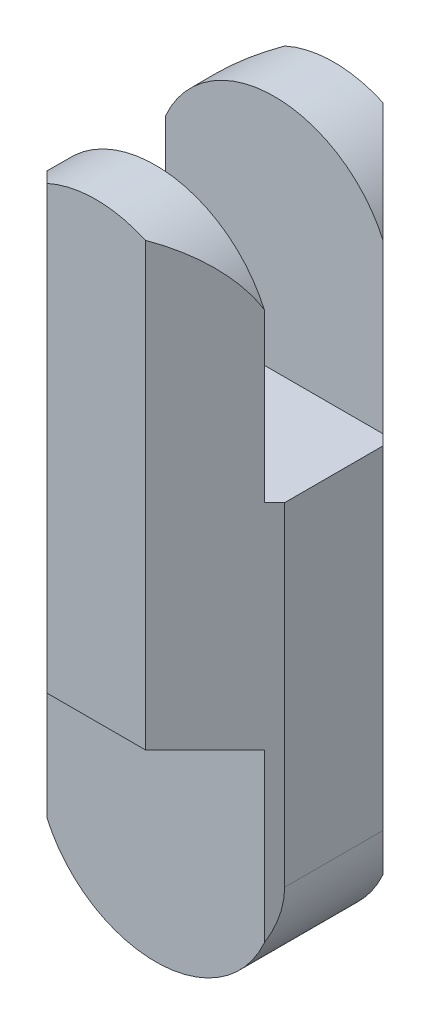
ISO-10303-21;
HEADER;
FILE_DESCRIPTION(('STEP AP214'),'2;1');
FILE_NAME('part.step','',(''),(''),'','','');
FILE_SCHEMA(('AUTOMOTIVE_DESIGN { 1 0 10303 214 1 1 1 1 }'));
ENDSEC;
DATA;
#1=APPLICATION_CONTEXT('core data for automotive mechanical design processes');
#2=APPLICATION_PROTOCOL_DEFINITION('international standard','automotive_design',2000,#1);
#3=PRODUCT_CONTEXT('',#1,'mechanical');
#4=PRODUCT('Part','Part','',(#3));
#5=PRODUCT_RELATED_PRODUCT_CATEGORY('part','',(#4));
#6=PRODUCT_DEFINITION_FORMATION('','',#4);
#7=PRODUCT_DEFINITION_CONTEXT('part definition',#1,'design');
#8=PRODUCT_DEFINITION('design','',#6,#7);
#9=PRODUCT_DEFINITION_SHAPE('','',#8);
#10=(LENGTH_UNIT() NAMED_UNIT(*) SI_UNIT(.MILLI.,.METRE.));
#11=(NAMED_UNIT(*) PLANE_ANGLE_UNIT() SI_UNIT($,.RADIAN.));
#12=(NAMED_UNIT(*) SI_UNIT($,.STERADIAN.) SOLID_ANGLE_UNIT());
#13=UNCERTAINTY_MEASURE_WITH_UNIT(LENGTH_MEASURE(1.E-05),#10,'distance_accuracy_value','');
#14=(GEOMETRIC_REPRESENTATION_CONTEXT(3) GLOBAL_UNCERTAINTY_ASSIGNED_CONTEXT((#13)) GLOBAL_UNIT_ASSIGNED_CONTEXT((#10,
#11,#12)) REPRESENTATION_CONTEXT('',''));
#15=CARTESIAN_POINT('',(0.,0.,0.));
#16=DIRECTION('',(0.,0.,1.));
#17=DIRECTION('',(1.,0.,0.));
#18=AXIS2_PLACEMENT_3D('',#15,#16,#17);
#19=CARTESIAN_POINT('',(4.14213562373094,58.,-10.));
#20=DIRECTION('',(0.,0.,1.));
#21=DIRECTION('',(1.,0.,0.));
#22=AXIS2_PLACEMENT_3D('',#19,#20,#21);
#23=PLANE('',#22);
#24=DIRECTION('',(0.,-1.,0.));
#25=VECTOR('',#24,1.);
#26=CARTESIAN_POINT('',(-4.14213562373096,58.,-10.));
#27=LINE('',#26,#25);
#28=CARTESIAN_POINT('',(-4.14213562373096,57.1017972112445,-10.));
#29=VERTEX_POINT('',#28);
#30=CARTESIAN_POINT('',(-4.14213562373096,20.,-10.));
#31=VERTEX_POINT('',#30);
#32=EDGE_CURVE('E186',#29,#31,#27,.T.);
#33=ORIENTED_EDGE('',*,*,#32,.F.);
#34=CARTESIAN_POINT('',(0.,48.,-10.));
#35=DIRECTION('',(0.,0.,1.));
#36=DIRECTION('',(1.,0.,0.));
#37=AXIS2_PLACEMENT_3D('',#34,#35,#36);
#38=CIRCLE('',#37,10.);
#39=CARTESIAN_POINT('',(4.14213562373094,57.1017972112446,-10.));
#40=VERTEX_POINT('',#39);
#41=EDGE_CURVE('E343',#29,#40,#38,.F.);
#42=ORIENTED_EDGE('',*,*,#41,.T.);
#43=DIRECTION('',(0.,-1.,0.));
#44=VECTOR('',#43,1.);
#45=CARTESIAN_POINT('',(4.14213562373094,58.,-10.));
#46=LINE('',#45,#44);
#47=CARTESIAN_POINT('',(4.14213562373094,20.,-10.));
#48=VERTEX_POINT('',#47);
#49=EDGE_CURVE('E189',#40,#48,#46,.T.);
#50=ORIENTED_EDGE('',*,*,#49,.T.);
#51=DIRECTION('',(1.,0.,0.));
#52=VECTOR('',#51,1.);
#53=CARTESIAN_POINT('',(10.,20.,-10.));
#54=LINE('',#53,#52);
#55=EDGE_CURVE('E261',#31,#48,#54,.T.);
#56=ORIENTED_EDGE('',*,*,#55,.F.);
#57=EDGE_LOOP('',(#33,#42,#50,#56));
#58=FACE_BOUND('',#57,.T.);
#59=ADVANCED_FACE('F39',(#58),#23,.F.);
#60=CARTESIAN_POINT('',(-4.14213562373096,58.,10.));
#61=DIRECTION('',(0.,0.,-1.));
#62=DIRECTION('',(-1.,0.,0.));
#63=AXIS2_PLACEMENT_3D('',#60,#61,#62);
#64=PLANE('',#63);
#65=DIRECTION('',(0.,-1.,0.));
#66=VECTOR('',#65,1.);
#67=CARTESIAN_POINT('',(4.14213562373096,58.,10.));
#68=LINE('',#67,#66);
#69=CARTESIAN_POINT('',(4.14213562373096,57.1017972112445,10.));
#70=VERTEX_POINT('',#69);
#71=CARTESIAN_POINT('',(4.14213562373096,20.,10.));
#72=VERTEX_POINT('',#71);
#73=EDGE_CURVE('E166',#70,#72,#68,.T.);
#74=ORIENTED_EDGE('',*,*,#73,.F.);
#75=CARTESIAN_POINT('',(0.,48.,10.));
#76=DIRECTION('',(0.,0.,-1.));
#77=DIRECTION('',(1.,0.,0.));
#78=AXIS2_PLACEMENT_3D('',#75,#76,#77);
#79=CIRCLE('',#78,10.);
#80=CARTESIAN_POINT('',(-4.14213562373096,57.1017972112445,10.));
#81=VERTEX_POINT('',#80);
#82=EDGE_CURVE('E153',#81,#70,#79,.T.);
#83=ORIENTED_EDGE('',*,*,#82,.F.);
#84=DIRECTION('',(0.,-1.,0.));
#85=VECTOR('',#84,1.);
#86=CARTESIAN_POINT('',(-4.14213562373096,58.,10.));
#87=LINE('',#86,#85);
#88=CARTESIAN_POINT('',(-4.14213562373096,20.,10.));
#89=VERTEX_POINT('',#88);
#90=EDGE_CURVE('E164',#81,#89,#87,.T.);
#91=ORIENTED_EDGE('',*,*,#90,.T.);
#92=DIRECTION('',(-1.,0.,0.));
#93=VECTOR('',#92,1.);
#94=CARTESIAN_POINT('',(-10.,20.,10.));
#95=LINE('',#94,#93);
#96=EDGE_CURVE('E278',#72,#89,#95,.T.);
#97=ORIENTED_EDGE('',*,*,#96,.F.);
#98=EDGE_LOOP('',(#74,#83,#91,#97));
#99=FACE_BOUND('',#98,.T.);
#100=ADVANCED_FACE('F162',(#99),#64,.F.);
#101=CARTESIAN_POINT('',(10.,58.,-4.14213562373095));
#102=DIRECTION('',(-0.707106781186547,0.,0.707106781186548));
#103=DIRECTION('',(0.707106781186548,0.,0.707106781186547));
#104=AXIS2_PLACEMENT_3D('',#101,#102,#103);
#105=PLANE('',#104);
#106=ORIENTED_EDGE('',*,*,#49,.F.);
#107=CARTESIAN_POINT('',(0.,48.,-14.1421356237309));
#108=DIRECTION('',(-0.707106781186547,0.,0.707106781186548));
#109=DIRECTION('',(0.707106781186548,0.,0.707106781186547));
#110=AXIS2_PLACEMENT_3D('',#107,#108,#109);
#111=ELLIPSE('',#110,14.1421356237309,10.);
#112=CARTESIAN_POINT('',(9.14213562373095,52.0523272618718,-5.));
#113=VERTEX_POINT('',#112);
#114=EDGE_CURVE('E339',#40,#113,#111,.F.);
#115=ORIENTED_EDGE('',*,*,#114,.T.);
#116=DIRECTION('',(0.,1.,0.));
#117=VECTOR('',#116,1.);
#118=CARTESIAN_POINT('',(9.14213562373095,58.,-5.));
#119=LINE('',#118,#117);
#120=CARTESIAN_POINT('',(9.14213562373095,38.,-5.));
#121=VERTEX_POINT('',#120);
#122=EDGE_CURVE('E246',#121,#113,#119,.T.);
#123=ORIENTED_EDGE('',*,*,#122,.F.);
#124=DIRECTION('',(0.707106781186548,0.,0.707106781186547));
#125=VECTOR('',#124,1.);
#126=CARTESIAN_POINT('',(10.,38.,-4.14213562373095));
#127=LINE('',#126,#125);
#128=CARTESIAN_POINT('',(10.,38.,-4.14213562373095));
#129=VERTEX_POINT('',#128);
#130=EDGE_CURVE('E258',#121,#129,#127,.T.);
#131=ORIENTED_EDGE('',*,*,#130,.T.);
#132=DIRECTION('',(0.,-1.,0.));
#133=VECTOR('',#132,1.);
#134=CARTESIAN_POINT('',(10.,58.,-4.14213562373095));
#135=LINE('',#134,#133);
#136=CARTESIAN_POINT('',(10.,10.,-4.14213562373095));
#137=VERTEX_POINT('',#136);
#138=EDGE_CURVE('E192',#129,#137,#135,.T.);
#139=ORIENTED_EDGE('',*,*,#138,.T.);
#140=CARTESIAN_POINT('',(0.,10.,-14.1421356237309));
#141=DIRECTION('',(-0.707106781186547,0.,0.707106781186548));
#142=DIRECTION('',(0.707106781186548,0.,0.707106781186547));
#143=AXIS2_PLACEMENT_3D('',#140,#141,#142);
#144=ELLIPSE('',#143,14.1421356237309,10.);
#145=CARTESIAN_POINT('',(9.14213562373095,5.94767273812816,-5.00000000000001));
#146=VERTEX_POINT('',#145);
#147=EDGE_CURVE('E312',#137,#146,#144,.F.);
#148=ORIENTED_EDGE('',*,*,#147,.T.);
#149=DIRECTION('',(0.,-1.,0.));
#150=VECTOR('',#149,1.);
#151=CARTESIAN_POINT('',(9.14213562373095,58.,-5.00000000000001));
#152=LINE('',#151,#150);
#153=CARTESIAN_POINT('',(9.14213562373095,20.,-5.00000000000001));
#154=VERTEX_POINT('',#153);
#155=EDGE_CURVE('E268',#154,#146,#152,.T.);
#156=ORIENTED_EDGE('',*,*,#155,.F.);
#157=DIRECTION('',(-0.707106781186548,0.,-0.707106781186547));
#158=VECTOR('',#157,1.);
#159=CARTESIAN_POINT('',(10.,20.,-4.14213562373095));
#160=LINE('',#159,#158);
#161=EDGE_CURVE('E274',#154,#48,#160,.T.);
#162=ORIENTED_EDGE('',*,*,#161,.T.);
#163=EDGE_LOOP('',(#106,#115,#123,#131,#139,#148,#156,#162));
#164=FACE_BOUND('',#163,.T.);
#165=ADVANCED_FACE('F320',(#164),#105,.F.);
#166=CARTESIAN_POINT('',(-4.14213562373096,58.,-10.));
#167=DIRECTION('',(0.707106781186548,0.,0.707106781186547));
#168=DIRECTION('',(0.707106781186547,0.,-0.707106781186548));
#169=AXIS2_PLACEMENT_3D('',#166,#167,#168);
#170=PLANE('',#169);
#171=DIRECTION('',(0.,-1.,0.));
#172=VECTOR('',#171,1.);
#173=CARTESIAN_POINT('',(-9.14213562373095,58.,-5.));
#174=LINE('',#173,#172);
#175=CARTESIAN_POINT('',(-9.14213562373095,52.0523272618718,-5.));
#176=VERTEX_POINT('',#175);
#177=CARTESIAN_POINT('',(-9.14213562373095,38.,-5.));
#178=VERTEX_POINT('',#177);
#179=EDGE_CURVE('E243',#176,#178,#174,.T.);
#180=ORIENTED_EDGE('',*,*,#179,.F.);
#181=CARTESIAN_POINT('',(0.,48.,-14.142135623731));
#182=DIRECTION('',(0.707106781186548,0.,0.707106781186547));
#183=DIRECTION('',(-0.707106781186547,0.,0.707106781186548));
#184=AXIS2_PLACEMENT_3D('',#181,#182,#183);
#185=ELLIPSE('',#184,14.1421356237309,10.);
#186=EDGE_CURVE('E350',#176,#29,#185,.F.);
#187=ORIENTED_EDGE('',*,*,#186,.T.);
#188=ORIENTED_EDGE('',*,*,#32,.T.);
#189=DIRECTION('',(-0.707106781186547,0.,0.707106781186548));
#190=VECTOR('',#189,1.);
#191=CARTESIAN_POINT('',(-4.14213562373096,20.,-10.));
#192=LINE('',#191,#190);
#193=CARTESIAN_POINT('',(-9.14213562373096,20.,-5.));
#194=VERTEX_POINT('',#193);
#195=EDGE_CURVE('E205',#31,#194,#192,.T.);
#196=ORIENTED_EDGE('',*,*,#195,.T.);
#197=DIRECTION('',(0.,1.,0.));
#198=VECTOR('',#197,1.);
#199=CARTESIAN_POINT('',(-9.14213562373096,58.,-5.));
#200=LINE('',#199,#198);
#201=CARTESIAN_POINT('',(-9.14213562373096,5.94767273812822,-5.));
#202=VERTEX_POINT('',#201);
#203=EDGE_CURVE('E202',#202,#194,#200,.T.);
#204=ORIENTED_EDGE('',*,*,#203,.F.);
#205=CARTESIAN_POINT('',(0.,10.,-14.142135623731));
#206=DIRECTION('',(0.707106781186548,0.,0.707106781186547));
#207=DIRECTION('',(-0.707106781186547,0.,0.707106781186548));
#208=AXIS2_PLACEMENT_3D('',#205,#206,#207);
#209=ELLIPSE('',#208,14.142135623731,10.);
#210=CARTESIAN_POINT('',(-10.,10.,-4.14213562373095));
#211=VERTEX_POINT('',#210);
#212=EDGE_CURVE('E298',#202,#211,#209,.F.);
#213=ORIENTED_EDGE('',*,*,#212,.T.);
#214=DIRECTION('',(0.,-1.,0.));
#215=VECTOR('',#214,1.);
#216=CARTESIAN_POINT('',(-10.,58.,-4.14213562373095));
#217=LINE('',#216,#215);
#218=CARTESIAN_POINT('',(-10.,38.,-4.14213562373096));
#219=VERTEX_POINT('',#218);
#220=EDGE_CURVE('E178',#219,#211,#217,.T.);
#221=ORIENTED_EDGE('',*,*,#220,.F.);
#222=DIRECTION('',(0.707106781186547,0.,-0.707106781186548));
#223=VECTOR('',#222,1.);
#224=CARTESIAN_POINT('',(-4.14213562373096,38.,-10.));
#225=LINE('',#224,#223);
#226=EDGE_CURVE('E254',#219,#178,#225,.T.);
#227=ORIENTED_EDGE('',*,*,#226,.T.);
#228=EDGE_LOOP('',(#180,#187,#188,#196,#204,#213,#221,#227));
#229=FACE_BOUND('',#228,.T.);
#230=ADVANCED_FACE('F330',(#229),#170,.F.);
#231=CARTESIAN_POINT('',(0.,0.,-5.));
#232=DIRECTION('',(0.,0.,1.));
#233=DIRECTION('',(1.,0.,0.));
#234=AXIS2_PLACEMENT_3D('',#231,#232,#233);
#235=PLANE('',#234);
#236=CARTESIAN_POINT('',(0.,48.,-5.));
#237=DIRECTION('',(0.,0.,1.));
#238=DIRECTION('',(1.,0.,0.));
#239=AXIS2_PLACEMENT_3D('',#236,#237,#238);
#240=CIRCLE('',#239,10.);
#241=EDGE_CURVE('E158',#176,#113,#240,.F.);
#242=ORIENTED_EDGE('',*,*,#241,.F.);
#243=ORIENTED_EDGE('',*,*,#179,.T.);
#244=DIRECTION('',(1.,0.,0.));
#245=VECTOR('',#244,1.);
#246=CARTESIAN_POINT('',(-10.,38.,-5.));
#247=LINE('',#246,#245);
#248=EDGE_CURVE('E236',#178,#121,#247,.T.);
#249=ORIENTED_EDGE('',*,*,#248,.T.);
#250=ORIENTED_EDGE('',*,*,#122,.T.);
#251=EDGE_LOOP('',(#242,#243,#249,#250));
#252=FACE_BOUND('',#251,.T.);
#253=ADVANCED_FACE('F357',(#252),#235,.T.);
#254=CARTESIAN_POINT('',(0.,0.,5.));
#255=DIRECTION('',(0.,0.,1.));
#256=DIRECTION('',(1.,0.,0.));
#257=AXIS2_PLACEMENT_3D('',#254,#255,#256);
#258=PLANE('',#257);
#259=DIRECTION('',(0.,-1.,0.));
#260=VECTOR('',#259,1.);
#261=CARTESIAN_POINT('',(-9.14213562373096,58.,5.));
#262=LINE('',#261,#260);
#263=CARTESIAN_POINT('',(-9.14213562373096,52.0523272618718,5.));
#264=VERTEX_POINT('',#263);
#265=CARTESIAN_POINT('',(-9.14213562373096,38.,5.));
#266=VERTEX_POINT('',#265);
#267=EDGE_CURVE('E234',#264,#266,#262,.T.);
#268=ORIENTED_EDGE('',*,*,#267,.F.);
#269=CARTESIAN_POINT('',(0.,48.,5.));
#270=DIRECTION('',(0.,0.,1.));
#271=DIRECTION('',(1.,0.,0.));
#272=AXIS2_PLACEMENT_3D('',#269,#270,#271);
#273=CIRCLE('',#272,10.);
#274=CARTESIAN_POINT('',(9.14213562373096,52.0523272618718,5.));
#275=VERTEX_POINT('',#274);
#276=EDGE_CURVE('E11',#264,#275,#273,.F.);
#277=ORIENTED_EDGE('',*,*,#276,.T.);
#278=DIRECTION('',(0.,1.,0.));
#279=VECTOR('',#278,1.);
#280=CARTESIAN_POINT('',(9.14213562373096,58.,5.));
#281=LINE('',#280,#279);
#282=CARTESIAN_POINT('',(9.14213562373096,38.,5.));
#283=VERTEX_POINT('',#282);
#284=EDGE_CURVE('E214',#283,#275,#281,.T.);
#285=ORIENTED_EDGE('',*,*,#284,.F.);
#286=DIRECTION('',(1.,0.,0.));
#287=VECTOR('',#286,1.);
#288=CARTESIAN_POINT('',(-10.,38.,5.));
#289=LINE('',#288,#287);
#290=EDGE_CURVE('E225',#266,#283,#289,.T.);
#291=ORIENTED_EDGE('',*,*,#290,.F.);
#292=EDGE_LOOP('',(#268,#277,#285,#291));
#293=FACE_BOUND('',#292,.T.);
#294=ADVANCED_FACE('F376',(#293),#258,.F.);
#295=CARTESIAN_POINT('',(0.,10.,-56.));
#296=DIRECTION('',(0.,0.,1.));
#297=DIRECTION('',(1.,0.,0.));
#298=AXIS2_PLACEMENT_3D('',#295,#296,#297);
#299=CYLINDRICAL_SURFACE('',#298,10.);
#300=CARTESIAN_POINT('',(0.,10.,-5.));
#301=DIRECTION('',(0.,0.,-1.));
#302=DIRECTION('',(-1.,0.,0.));
#303=AXIS2_PLACEMENT_3D('',#300,#301,#302);
#304=CIRCLE('',#303,10.);
#305=EDGE_CURVE('E62',#146,#202,#304,.T.);
#306=ORIENTED_EDGE('',*,*,#305,.F.);
#307=ORIENTED_EDGE('',*,*,#147,.F.);
#308=DIRECTION('',(0.,0.,1.));
#309=VECTOR('',#308,1.);
#310=CARTESIAN_POINT('',(10.,10.,-56.));
#311=LINE('',#310,#309);
#312=CARTESIAN_POINT('',(10.,10.,4.14213562373095));
#313=VERTEX_POINT('',#312);
#314=EDGE_CURVE('E294',#137,#313,#311,.T.);
#315=ORIENTED_EDGE('',*,*,#314,.T.);
#316=CARTESIAN_POINT('',(0.,10.,14.1421356237309));
#317=DIRECTION('',(-0.707106781186548,0.,-0.707106781186548));
#318=DIRECTION('',(-0.707106781186548,0.,0.707106781186547));
#319=AXIS2_PLACEMENT_3D('',#316,#317,#318);
#320=ELLIPSE('',#319,14.1421356237309,10.);
#321=CARTESIAN_POINT('',(9.14213562373095,5.94767273812818,5.));
#322=VERTEX_POINT('',#321);
#323=EDGE_CURVE('E305',#322,#313,#320,.F.);
#324=ORIENTED_EDGE('',*,*,#323,.F.);
#325=CARTESIAN_POINT('',(0.,10.,5.));
#326=DIRECTION('',(0.,0.,1.));
#327=DIRECTION('',(1.,0.,0.));
#328=AXIS2_PLACEMENT_3D('',#325,#326,#327);
#329=CIRCLE('',#328,10.);
#330=CARTESIAN_POINT('',(-9.14213562373095,5.94767273812819,5.00000000000001));
#331=VERTEX_POINT('',#330);
#332=EDGE_CURVE('E195',#331,#322,#329,.T.);
#333=ORIENTED_EDGE('',*,*,#332,.F.);
#334=CARTESIAN_POINT('',(0.,10.,14.142135623731));
#335=DIRECTION('',(0.707106781186548,0.,-0.707106781186547));
#336=DIRECTION('',(0.707106781186547,0.,0.707106781186548));
#337=AXIS2_PLACEMENT_3D('',#334,#335,#336);
#338=ELLIPSE('',#337,14.142135623731,10.);
#339=CARTESIAN_POINT('',(-10.,10.,4.14213562373096));
#340=VERTEX_POINT('',#339);
#341=EDGE_CURVE('E308',#340,#331,#338,.F.);
#342=ORIENTED_EDGE('',*,*,#341,.F.);
#343=DIRECTION('',(0.,0.,1.));
#344=VECTOR('',#343,1.);
#345=CARTESIAN_POINT('',(-10.,10.,-56.));
#346=LINE('',#345,#344);
#347=EDGE_CURVE('E293',#211,#340,#346,.T.);
#348=ORIENTED_EDGE('',*,*,#347,.F.);
#349=ORIENTED_EDGE('',*,*,#212,.F.);
#350=EDGE_LOOP('',(#306,#307,#315,#324,#333,#342,#348,#349));
#351=FACE_BOUND('',#350,.T.);
#352=ADVANCED_FACE('F322',(#351),#299,.T.);
#353=CARTESIAN_POINT('',(-10.,58.,-4.14213562373095));
#354=DIRECTION('',(1.,0.,0.));
#355=DIRECTION('',(0.,0.,-1.));
#356=AXIS2_PLACEMENT_3D('',#353,#354,#355);
#357=PLANE('',#356);
#358=DIRECTION('',(0.,-1.,0.));
#359=VECTOR('',#358,1.);
#360=CARTESIAN_POINT('',(-10.,58.,4.14213562373096));
#361=LINE('',#360,#359);
#362=CARTESIAN_POINT('',(-10.,38.,4.14213562373096));
#363=VERTEX_POINT('',#362);
#364=EDGE_CURVE('E174',#363,#340,#361,.T.);
#365=ORIENTED_EDGE('',*,*,#364,.F.);
#366=DIRECTION('',(0.,0.,1.));
#367=VECTOR('',#366,1.);
#368=CARTESIAN_POINT('',(-10.,38.,-5.));
#369=LINE('',#368,#367);
#370=EDGE_CURVE('E230',#219,#363,#369,.T.);
#371=ORIENTED_EDGE('',*,*,#370,.F.);
#372=ORIENTED_EDGE('',*,*,#220,.T.);
#373=ORIENTED_EDGE('',*,*,#347,.T.);
#374=EDGE_LOOP('',(#365,#371,#372,#373));
#375=FACE_BOUND('',#374,.T.);
#376=ADVANCED_FACE('F374',(#375),#357,.F.);
#377=CARTESIAN_POINT('',(10.,58.,4.14213562373095));
#378=DIRECTION('',(-1.,0.,0.));
#379=DIRECTION('',(0.,0.,1.));
#380=AXIS2_PLACEMENT_3D('',#377,#378,#379);
#381=PLANE('',#380);
#382=ORIENTED_EDGE('',*,*,#138,.F.);
#383=DIRECTION('',(0.,0.,1.));
#384=VECTOR('',#383,1.);
#385=CARTESIAN_POINT('',(10.,38.,-5.));
#386=LINE('',#385,#384);
#387=CARTESIAN_POINT('',(10.,38.,4.14213562373096));
#388=VERTEX_POINT('',#387);
#389=EDGE_CURVE('E221',#129,#388,#386,.T.);
#390=ORIENTED_EDGE('',*,*,#389,.T.);
#391=DIRECTION('',(0.,-1.,0.));
#392=VECTOR('',#391,1.);
#393=CARTESIAN_POINT('',(10.,58.,4.14213562373095));
#394=LINE('',#393,#392);
#395=EDGE_CURVE('E180',#388,#313,#394,.T.);
#396=ORIENTED_EDGE('',*,*,#395,.T.);
#397=ORIENTED_EDGE('',*,*,#314,.F.);
#398=EDGE_LOOP('',(#382,#390,#396,#397));
#399=FACE_BOUND('',#398,.T.);
#400=ADVANCED_FACE('F41',(#399),#381,.F.);
#401=CARTESIAN_POINT('',(-10.,58.,4.14213562373096));
#402=DIRECTION('',(0.707106781186548,0.,-0.707106781186547));
#403=DIRECTION('',(-0.707106781186547,0.,-0.707106781186548));
#404=AXIS2_PLACEMENT_3D('',#401,#402,#403);
#405=PLANE('',#404);
#406=ORIENTED_EDGE('',*,*,#90,.F.);
#407=CARTESIAN_POINT('',(0.,48.,14.142135623731));
#408=DIRECTION('',(0.707106781186548,0.,-0.707106781186547));
#409=DIRECTION('',(0.707106781186547,0.,0.707106781186548));
#410=AXIS2_PLACEMENT_3D('',#407,#408,#409);
#411=ELLIPSE('',#410,14.142135623731,10.);
#412=EDGE_CURVE('E150',#81,#264,#411,.F.);
#413=ORIENTED_EDGE('',*,*,#412,.T.);
#414=ORIENTED_EDGE('',*,*,#267,.T.);
#415=DIRECTION('',(-0.707106781186547,0.,-0.707106781186548));
#416=VECTOR('',#415,1.);
#417=CARTESIAN_POINT('',(-10.,38.,4.14213562373096));
#418=LINE('',#417,#416);
#419=EDGE_CURVE('E250',#266,#363,#418,.T.);
#420=ORIENTED_EDGE('',*,*,#419,.T.);
#421=ORIENTED_EDGE('',*,*,#364,.T.);
#422=ORIENTED_EDGE('',*,*,#341,.T.);
#423=DIRECTION('',(0.,-1.,0.));
#424=VECTOR('',#423,1.);
#425=CARTESIAN_POINT('',(-9.14213562373095,58.,5.));
#426=LINE('',#425,#424);
#427=CARTESIAN_POINT('',(-9.14213562373095,20.,5.));
#428=VERTEX_POINT('',#427);
#429=EDGE_CURVE('E288',#428,#331,#426,.T.);
#430=ORIENTED_EDGE('',*,*,#429,.F.);
#431=DIRECTION('',(0.707106781186547,0.,0.707106781186548));
#432=VECTOR('',#431,1.);
#433=CARTESIAN_POINT('',(-10.,20.,4.14213562373096));
#434=LINE('',#433,#432);
#435=EDGE_CURVE('E172',#428,#89,#434,.T.);
#436=ORIENTED_EDGE('',*,*,#435,.T.);
#437=EDGE_LOOP('',(#406,#413,#414,#420,#421,#422,#430,#436));
#438=FACE_BOUND('',#437,.T.);
#439=ADVANCED_FACE('F170',(#438),#405,.F.);
#440=CARTESIAN_POINT('',(4.14213562373096,58.,10.));
#441=DIRECTION('',(-0.707106781186548,0.,-0.707106781186548));
#442=DIRECTION('',(-0.707106781186548,0.,0.707106781186547));
#443=AXIS2_PLACEMENT_3D('',#440,#441,#442);
#444=PLANE('',#443);
#445=ORIENTED_EDGE('',*,*,#284,.T.);
#446=CARTESIAN_POINT('',(0.,48.,14.142135623731));
#447=DIRECTION('',(-0.707106781186548,0.,-0.707106781186548));
#448=DIRECTION('',(-0.707106781186548,0.,0.707106781186547));
#449=AXIS2_PLACEMENT_3D('',#446,#447,#448);
#450=ELLIPSE('',#449,14.1421356237309,10.);
#451=EDGE_CURVE('E55',#275,#70,#450,.F.);
#452=ORIENTED_EDGE('',*,*,#451,.T.);
#453=ORIENTED_EDGE('',*,*,#73,.T.);
#454=DIRECTION('',(0.707106781186548,0.,-0.707106781186547));
#455=VECTOR('',#454,1.);
#456=CARTESIAN_POINT('',(4.14213562373096,20.,10.));
#457=LINE('',#456,#455);
#458=CARTESIAN_POINT('',(9.14213562373096,20.,5.));
#459=VERTEX_POINT('',#458);
#460=EDGE_CURVE('E198',#72,#459,#457,.T.);
#461=ORIENTED_EDGE('',*,*,#460,.T.);
#462=DIRECTION('',(0.,1.,0.));
#463=VECTOR('',#462,1.);
#464=CARTESIAN_POINT('',(9.14213562373095,58.,5.));
#465=LINE('',#464,#463);
#466=EDGE_CURVE('E283',#322,#459,#465,.T.);
#467=ORIENTED_EDGE('',*,*,#466,.F.);
#468=ORIENTED_EDGE('',*,*,#323,.T.);
#469=ORIENTED_EDGE('',*,*,#395,.F.);
#470=DIRECTION('',(-0.707106781186548,0.,0.707106781186547));
#471=VECTOR('',#470,1.);
#472=CARTESIAN_POINT('',(4.14213562373096,38.,10.));
#473=LINE('',#472,#471);
#474=EDGE_CURVE('E48',#388,#283,#473,.T.);
#475=ORIENTED_EDGE('',*,*,#474,.T.);
#476=EDGE_LOOP('',(#445,#452,#453,#461,#467,#468,#469,#475));
#477=FACE_BOUND('',#476,.T.);
#478=ADVANCED_FACE('F213',(#477),#444,.F.);
#479=CARTESIAN_POINT('',(-10.,20.,5.));
#480=DIRECTION('',(0.,1.,0.));
#481=DIRECTION('',(0.,0.,1.));
#482=AXIS2_PLACEMENT_3D('',#479,#480,#481);
#483=PLANE('',#482);
#484=DIRECTION('',(-1.,0.,0.));
#485=VECTOR('',#484,1.);
#486=CARTESIAN_POINT('',(-10.,20.,5.));
#487=LINE('',#486,#485);
#488=EDGE_CURVE('E279',#459,#428,#487,.T.);
#489=ORIENTED_EDGE('',*,*,#488,.F.);
#490=ORIENTED_EDGE('',*,*,#460,.F.);
#491=ORIENTED_EDGE('',*,*,#96,.T.);
#492=ORIENTED_EDGE('',*,*,#435,.F.);
#493=EDGE_LOOP('',(#489,#490,#491,#492));
#494=FACE_BOUND('',#493,.T.);
#495=ADVANCED_FACE('F368',(#494),#483,.F.);
#496=CARTESIAN_POINT('',(0.,10.,5.));
#497=DIRECTION('',(0.,0.,1.));
#498=DIRECTION('',(1.,0.,0.));
#499=AXIS2_PLACEMENT_3D('',#496,#497,#498);
#500=PLANE('',#499);
#501=ORIENTED_EDGE('',*,*,#429,.T.);
#502=ORIENTED_EDGE('',*,*,#332,.T.);
#503=ORIENTED_EDGE('',*,*,#466,.T.);
#504=ORIENTED_EDGE('',*,*,#488,.T.);
#505=EDGE_LOOP('',(#501,#502,#503,#504));
#506=FACE_BOUND('',#505,.T.);
#507=ADVANCED_FACE('F370',(#506),#500,.T.);
#508=CARTESIAN_POINT('',(10.,20.,-5.00000000000001));
#509=DIRECTION('',(0.,1.,0.));
#510=DIRECTION('',(0.,0.,1.));
#511=AXIS2_PLACEMENT_3D('',#508,#509,#510);
#512=PLANE('',#511);
#513=DIRECTION('',(1.,0.,0.));
#514=VECTOR('',#513,1.);
#515=CARTESIAN_POINT('',(10.,20.,-5.00000000000001));
#516=LINE('',#515,#514);
#517=EDGE_CURVE('E264',#194,#154,#516,.T.);
#518=ORIENTED_EDGE('',*,*,#517,.F.);
#519=ORIENTED_EDGE('',*,*,#195,.F.);
#520=ORIENTED_EDGE('',*,*,#55,.T.);
#521=ORIENTED_EDGE('',*,*,#161,.F.);
#522=EDGE_LOOP('',(#518,#519,#520,#521));
#523=FACE_BOUND('',#522,.T.);
#524=ADVANCED_FACE('F335',(#523),#512,.F.);
#525=CARTESIAN_POINT('',(0.,10.,-5.));
#526=DIRECTION('',(0.,0.,-1.));
#527=DIRECTION('',(-1.,0.,0.));
#528=AXIS2_PLACEMENT_3D('',#525,#526,#527);
#529=PLANE('',#528);
#530=ORIENTED_EDGE('',*,*,#155,.T.);
#531=ORIENTED_EDGE('',*,*,#305,.T.);
#532=ORIENTED_EDGE('',*,*,#203,.T.);
#533=ORIENTED_EDGE('',*,*,#517,.T.);
#534=EDGE_LOOP('',(#530,#531,#532,#533));
#535=FACE_BOUND('',#534,.T.);
#536=ADVANCED_FACE('F333',(#535),#529,.T.);
#537=CARTESIAN_POINT('',(-10.,38.,-5.));
#538=DIRECTION('',(0.,-1.,0.));
#539=DIRECTION('',(0.,0.,-1.));
#540=AXIS2_PLACEMENT_3D('',#537,#538,#539);
#541=PLANE('',#540);
#542=ORIENTED_EDGE('',*,*,#248,.F.);
#543=ORIENTED_EDGE('',*,*,#226,.F.);
#544=ORIENTED_EDGE('',*,*,#370,.T.);
#545=ORIENTED_EDGE('',*,*,#419,.F.);
#546=ORIENTED_EDGE('',*,*,#290,.T.);
#547=ORIENTED_EDGE('',*,*,#474,.F.);
#548=ORIENTED_EDGE('',*,*,#389,.F.);
#549=ORIENTED_EDGE('',*,*,#130,.F.);
#550=EDGE_LOOP('',(#542,#543,#544,#545,#546,#547,#548,#549));
#551=FACE_BOUND('',#550,.T.);
#552=ADVANCED_FACE('F220',(#551),#541,.F.);
#553=CARTESIAN_POINT('',(0.,48.,-20.));
#554=DIRECTION('',(0.,0.,1.));
#555=DIRECTION('',(1.,0.,0.));
#556=AXIS2_PLACEMENT_3D('',#553,#554,#555);
#557=CYLINDRICAL_SURFACE('',#556,10.);
#558=ORIENTED_EDGE('',*,*,#82,.T.);
#559=ORIENTED_EDGE('',*,*,#451,.F.);
#560=ORIENTED_EDGE('',*,*,#276,.F.);
#561=ORIENTED_EDGE('',*,*,#412,.F.);
#562=EDGE_LOOP('',(#558,#559,#560,#561));
#563=FACE_BOUND('',#562,.T.);
#564=ADVANCED_FACE('F152',(#563),#557,.T.);
#565=ORIENTED_EDGE('',*,*,#241,.T.);
#566=ORIENTED_EDGE('',*,*,#114,.F.);
#567=ORIENTED_EDGE('',*,*,#41,.F.);
#568=ORIENTED_EDGE('',*,*,#186,.F.);
#569=EDGE_LOOP('',(#565,#566,#567,#568));
#570=FACE_BOUND('',#569,.T.);
#571=ADVANCED_FACE('F438',(#570),#557,.T.);
#572=CLOSED_SHELL('',(#59,#100,#165,#230,#253,#294,#352,#376,#400,#439,#478,#495,#507,#524,#536,
#552,#564,#571));
#573=MANIFOLD_SOLID_BREP('B2',#572);
#574=ADVANCED_BREP_SHAPE_REPRESENTATION('',(#18,#573),#14);
#575=SHAPE_DEFINITION_REPRESENTATION(#9,#574);
ENDSEC;
END-ISO-10303-21;
